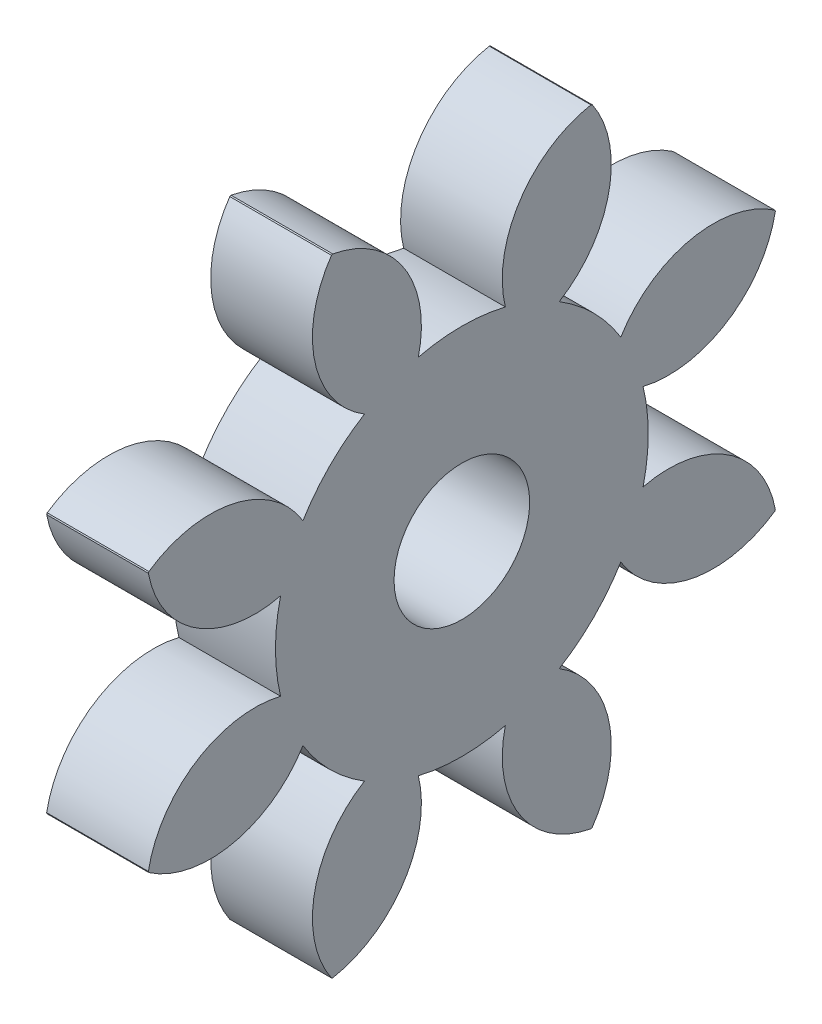
ISO-10303-21;
HEADER;
FILE_DESCRIPTION(('STEP AP214'),'2;1');
FILE_NAME('part.step','',(''),(''),'','','');
FILE_SCHEMA(('AUTOMOTIVE_DESIGN { 1 0 10303 214 1 1 1 1 }'));
ENDSEC;
DATA;
#1=APPLICATION_CONTEXT('core data for automotive mechanical design processes');
#2=APPLICATION_PROTOCOL_DEFINITION('international standard','automotive_design',2000,#1);
#3=PRODUCT_CONTEXT('',#1,'mechanical');
#4=PRODUCT('Part','Part','',(#3));
#5=PRODUCT_RELATED_PRODUCT_CATEGORY('part','',(#4));
#6=PRODUCT_DEFINITION_FORMATION('','',#4);
#7=PRODUCT_DEFINITION_CONTEXT('part definition',#1,'design');
#8=PRODUCT_DEFINITION('design','',#6,#7);
#9=PRODUCT_DEFINITION_SHAPE('','',#8);
#10=(LENGTH_UNIT() NAMED_UNIT(*) SI_UNIT(.MILLI.,.METRE.));
#11=(NAMED_UNIT(*) PLANE_ANGLE_UNIT() SI_UNIT($,.RADIAN.));
#12=(NAMED_UNIT(*) SI_UNIT($,.STERADIAN.) SOLID_ANGLE_UNIT());
#13=UNCERTAINTY_MEASURE_WITH_UNIT(LENGTH_MEASURE(1.E-05),#10,'distance_accuracy_value','');
#14=(GEOMETRIC_REPRESENTATION_CONTEXT(3) GLOBAL_UNCERTAINTY_ASSIGNED_CONTEXT((#13)) GLOBAL_UNIT_ASSIGNED_CONTEXT((#10,
#11,#12)) REPRESENTATION_CONTEXT('',''));
#15=CARTESIAN_POINT('',(0.,0.,0.));
#16=DIRECTION('',(0.,0.,1.));
#17=DIRECTION('',(1.,0.,0.));
#18=AXIS2_PLACEMENT_3D('',#15,#16,#17);
#19=CARTESIAN_POINT('',(1.5,0.,0.));
#20=DIRECTION('',(-1.,0.,0.));
#21=DIRECTION('',(0.,0.,1.));
#22=AXIS2_PLACEMENT_3D('',#19,#20,#21);
#23=PLANE('',#22);
#24=CARTESIAN_POINT('',(1.5,0.,0.));
#25=DIRECTION('',(-1.,0.,0.));
#26=DIRECTION('',(0.,0.,1.));
#27=AXIS2_PLACEMENT_3D('',#24,#25,#26);
#28=CIRCLE('',#27,1.);
#29=CARTESIAN_POINT('',(1.5,0.,1.));
#30=VERTEX_POINT('',#29);
#31=EDGE_CURVE('E294',#30,#30,#28,.F.);
#32=ORIENTED_EDGE('',*,*,#31,.F.);
#33=EDGE_LOOP('',(#32));
#34=FACE_BOUND('',#33,.T.);
#35=CARTESIAN_POINT('',(1.5,0.603752810087811,3.70996470244194));
#36=DIRECTION('',(-1.,0.,0.));
#37=DIRECTION('',(0.,0.707106781186549,-0.707106781186546));
#38=AXIS2_PLACEMENT_3D('',#35,#36,#37);
#39=CIRCLE('',#38,1.6);
#40=CARTESIAN_POINT('',(1.5,1.92286389301455,4.61547337214082));
#41=VERTEX_POINT('',#40);
#42=CARTESIAN_POINT('',(1.5,1.43655002864459,2.34378433632475));
#43=VERTEX_POINT('',#42);
#44=EDGE_CURVE('E416',#41,#43,#39,.T.);
#45=ORIENTED_EDGE('',*,*,#44,.F.);
#46=CARTESIAN_POINT('',(1.5,0.,0.));
#47=DIRECTION('',(-1.,0.,0.));
#48=DIRECTION('',(0.,0.,1.));
#49=AXIS2_PLACEMENT_3D('',#46,#47,#48);
#50=CIRCLE('',#49,5.);
#51=CARTESIAN_POINT('',(1.5,1.90396242177733,4.62330261787608));
#52=VERTEX_POINT('',#51);
#53=EDGE_CURVE('E580',#52,#41,#50,.T.);
#54=ORIENTED_EDGE('',*,*,#53,.F.);
#55=CARTESIAN_POINT('',(1.5,2.19642349288588,3.05025890523296));
#56=DIRECTION('',(-1.,0.,0.));
#57=DIRECTION('',(0.,1.,0.));
#58=AXIS2_PLACEMENT_3D('',#55,#56,#57);
#59=CIRCLE('',#58,1.6);
#60=CARTESIAN_POINT('',(1.5,0.641511531085708,2.67310006462236));
#61=VERTEX_POINT('',#60);
#62=EDGE_CURVE('E392',#61,#52,#59,.T.);
#63=ORIENTED_EDGE('',*,*,#62,.F.);
#64=CARTESIAN_POINT('',(1.5,0.,0.));
#65=DIRECTION('',(-1.,0.,0.));
#66=DIRECTION('',(0.,1.,0.));
#67=AXIS2_PLACEMENT_3D('',#64,#65,#66);
#68=CIRCLE('',#67,2.749);
#69=CARTESIAN_POINT('',(1.5,-0.641511531085726,2.67310006462236));
#70=VERTEX_POINT('',#69);
#71=EDGE_CURVE('E399',#70,#61,#68,.T.);
#72=ORIENTED_EDGE('',*,*,#71,.F.);
#73=CARTESIAN_POINT('',(1.5,-2.1964234928859,3.05025890523294));
#74=DIRECTION('',(-1.,0.,0.));
#75=DIRECTION('',(0.,1.,0.));
#76=AXIS2_PLACEMENT_3D('',#73,#74,#75);
#77=CIRCLE('',#76,1.6);
#78=CARTESIAN_POINT('',(1.5,-1.90396242177737,4.62330261787606));
#79=VERTEX_POINT('',#78);
#80=EDGE_CURVE('E395',#79,#70,#77,.T.);
#81=ORIENTED_EDGE('',*,*,#80,.F.);
#82=CARTESIAN_POINT('',(1.5,-1.92286389301459,4.6154733721408));
#83=VERTEX_POINT('',#82);
#84=EDGE_CURVE('E553',#83,#79,#50,.T.);
#85=ORIENTED_EDGE('',*,*,#84,.F.);
#86=CARTESIAN_POINT('',(1.5,-0.603752810087837,3.70996470244193));
#87=DIRECTION('',(-1.,0.,0.));
#88=DIRECTION('',(0.,0.707106781186544,0.707106781186551));
#89=AXIS2_PLACEMENT_3D('',#86,#87,#88);
#90=CIRCLE('',#89,1.6);
#91=CARTESIAN_POINT('',(1.5,-1.43655002864461,2.34378433632474));
#92=VERTEX_POINT('',#91);
#93=EDGE_CURVE('E369',#92,#83,#90,.T.);
#94=ORIENTED_EDGE('',*,*,#93,.F.);
#95=CARTESIAN_POINT('',(1.5,0.,0.));
#96=DIRECTION('',(-1.,0.,0.));
#97=DIRECTION('',(0.,0.707106781186544,0.707106781186551));
#98=AXIS2_PLACEMENT_3D('',#95,#96,#97);
#99=CIRCLE('',#98,2.749);
#100=CARTESIAN_POINT('',(1.5,-2.34378433632475,1.43655002864458));
#101=VERTEX_POINT('',#100);
#102=EDGE_CURVE('E376',#101,#92,#99,.T.);
#103=ORIENTED_EDGE('',*,*,#102,.F.);
#104=CARTESIAN_POINT('',(1.5,-3.70996470244194,0.603752810087798));
#105=DIRECTION('',(-1.,0.,0.));
#106=DIRECTION('',(0.,0.707106781186544,0.707106781186551));
#107=AXIS2_PLACEMENT_3D('',#104,#105,#106);
#108=CIRCLE('',#107,1.6);
#109=CARTESIAN_POINT('',(1.5,-4.61547337214082,1.92286389301454));
#110=VERTEX_POINT('',#109);
#111=EDGE_CURVE('E372',#110,#101,#108,.T.);
#112=ORIENTED_EDGE('',*,*,#111,.F.);
#113=CARTESIAN_POINT('',(1.5,-4.62330261787608,1.90396242177732));
#114=VERTEX_POINT('',#113);
#115=EDGE_CURVE('E588',#114,#110,#50,.T.);
#116=ORIENTED_EDGE('',*,*,#115,.F.);
#117=CARTESIAN_POINT('',(1.5,-3.05025890523297,2.19642349288587));
#118=DIRECTION('',(-1.,0.,0.));
#119=DIRECTION('',(0.,0.,1.));
#120=AXIS2_PLACEMENT_3D('',#117,#118,#119);
#121=CIRCLE('',#120,1.6);
#122=CARTESIAN_POINT('',(1.5,-2.67310006462236,0.641511531085698));
#123=VERTEX_POINT('',#122);
#124=EDGE_CURVE('E345',#123,#114,#121,.T.);
#125=ORIENTED_EDGE('',*,*,#124,.F.);
#126=CARTESIAN_POINT('',(1.5,0.,0.));
#127=DIRECTION('',(-1.,0.,0.));
#128=DIRECTION('',(0.,0.,1.));
#129=AXIS2_PLACEMENT_3D('',#126,#127,#128);
#130=CIRCLE('',#129,2.749);
#131=CARTESIAN_POINT('',(1.5,-2.67310006462236,-0.641511531085736));
#132=VERTEX_POINT('',#131);
#133=EDGE_CURVE('E352',#132,#123,#130,.T.);
#134=ORIENTED_EDGE('',*,*,#133,.F.);
#135=CARTESIAN_POINT('',(1.5,-3.05025890523294,-2.19642349288591));
#136=DIRECTION('',(-1.,0.,0.));
#137=DIRECTION('',(0.,0.,1.));
#138=AXIS2_PLACEMENT_3D('',#135,#136,#137);
#139=CIRCLE('',#138,1.6);
#140=CARTESIAN_POINT('',(1.5,-4.62330261787606,-1.90396242177738));
#141=VERTEX_POINT('',#140);
#142=EDGE_CURVE('E348',#141,#132,#139,.T.);
#143=ORIENTED_EDGE('',*,*,#142,.F.);
#144=CARTESIAN_POINT('',(1.5,-4.6154733721408,-1.9228638930146));
#145=VERTEX_POINT('',#144);
#146=EDGE_CURVE('E591',#145,#141,#50,.T.);
#147=ORIENTED_EDGE('',*,*,#146,.F.);
#148=CARTESIAN_POINT('',(1.5,-3.70996470244193,-0.60375281008785));
#149=DIRECTION('',(-1.,0.,0.));
#150=DIRECTION('',(0.,-0.707106781186554,0.707106781186541));
#151=AXIS2_PLACEMENT_3D('',#148,#149,#150);
#152=CIRCLE('',#151,1.6);
#153=CARTESIAN_POINT('',(1.5,-2.34378433632473,-1.43655002864461));
#154=VERTEX_POINT('',#153);
#155=EDGE_CURVE('E321',#154,#145,#152,.T.);
#156=ORIENTED_EDGE('',*,*,#155,.F.);
#157=CARTESIAN_POINT('',(1.5,0.,0.));
#158=DIRECTION('',(-1.,0.,0.));
#159=DIRECTION('',(0.,-0.707106781186554,0.707106781186541));
#160=AXIS2_PLACEMENT_3D('',#157,#158,#159);
#161=CIRCLE('',#160,2.749);
#162=CARTESIAN_POINT('',(1.5,-1.43655002864457,-2.34378433632476));
#163=VERTEX_POINT('',#162);
#164=EDGE_CURVE('E328',#163,#154,#161,.T.);
#165=ORIENTED_EDGE('',*,*,#164,.F.);
#166=CARTESIAN_POINT('',(1.5,-0.603752810087786,-3.70996470244194));
#167=DIRECTION('',(-1.,0.,0.));
#168=DIRECTION('',(0.,-0.707106781186554,0.707106781186541));
#169=AXIS2_PLACEMENT_3D('',#166,#167,#168);
#170=CIRCLE('',#169,1.6);
#171=CARTESIAN_POINT('',(1.5,-1.92286389301452,-4.61547337214083));
#172=VERTEX_POINT('',#171);
#173=EDGE_CURVE('E324',#172,#163,#170,.T.);
#174=ORIENTED_EDGE('',*,*,#173,.F.);
#175=CARTESIAN_POINT('',(1.5,-1.9039624217773,-4.62330261787609));
#176=VERTEX_POINT('',#175);
#177=EDGE_CURVE('E598',#176,#172,#50,.T.);
#178=ORIENTED_EDGE('',*,*,#177,.F.);
#179=CARTESIAN_POINT('',(1.5,-2.19642349288586,-3.05025890523298));
#180=DIRECTION('',(-1.,0.,0.));
#181=DIRECTION('',(0.,-1.,0.));
#182=AXIS2_PLACEMENT_3D('',#179,#180,#181);
#183=CIRCLE('',#182,1.6);
#184=CARTESIAN_POINT('',(1.5,-0.641511531085689,-2.67310006462237));
#185=VERTEX_POINT('',#184);
#186=EDGE_CURVE('E297',#185,#176,#183,.T.);
#187=ORIENTED_EDGE('',*,*,#186,.F.);
#188=CARTESIAN_POINT('',(1.5,0.,0.));
#189=DIRECTION('',(-1.,0.,0.));
#190=DIRECTION('',(0.,-1.,0.));
#191=AXIS2_PLACEMENT_3D('',#188,#189,#190);
#192=CIRCLE('',#191,2.749);
#193=CARTESIAN_POINT('',(1.5,0.641511531085745,-2.67310006462235));
#194=VERTEX_POINT('',#193);
#195=EDGE_CURVE('E304',#194,#185,#192,.T.);
#196=ORIENTED_EDGE('',*,*,#195,.F.);
#197=CARTESIAN_POINT('',(1.5,2.19642349288593,-3.05025890523293));
#198=DIRECTION('',(-1.,0.,0.));
#199=DIRECTION('',(0.,-1.,0.));
#200=AXIS2_PLACEMENT_3D('',#197,#198,#199);
#201=CIRCLE('',#200,1.6);
#202=CARTESIAN_POINT('',(1.5,1.9039624217774,-4.62330261787605));
#203=VERTEX_POINT('',#202);
#204=EDGE_CURVE('E300',#203,#194,#201,.T.);
#205=ORIENTED_EDGE('',*,*,#204,.F.);
#206=CARTESIAN_POINT('',(1.5,1.92286389301462,-4.61547337214079));
#207=VERTEX_POINT('',#206);
#208=EDGE_CURVE('E517',#207,#203,#50,.T.);
#209=ORIENTED_EDGE('',*,*,#208,.F.);
#210=CARTESIAN_POINT('',(1.5,0.603752810087863,-3.70996470244193));
#211=DIRECTION('',(-1.,0.,0.));
#212=DIRECTION('',(0.,-0.707106781186539,-0.707106781186556));
#213=AXIS2_PLACEMENT_3D('',#210,#211,#212);
#214=CIRCLE('',#213,1.6);
#215=CARTESIAN_POINT('',(1.5,1.43655002864462,-2.34378433632473));
#216=VERTEX_POINT('',#215);
#217=EDGE_CURVE('E268',#216,#207,#214,.T.);
#218=ORIENTED_EDGE('',*,*,#217,.F.);
#219=CARTESIAN_POINT('',(1.5,0.,0.));
#220=DIRECTION('',(-1.,0.,0.));
#221=DIRECTION('',(0.,-0.707106781186539,-0.707106781186556));
#222=AXIS2_PLACEMENT_3D('',#219,#220,#221);
#223=CIRCLE('',#222,2.749);
#224=CARTESIAN_POINT('',(1.5,2.34378433632476,-1.43655002864457));
#225=VERTEX_POINT('',#224);
#226=EDGE_CURVE('E267',#225,#216,#223,.T.);
#227=ORIENTED_EDGE('',*,*,#226,.F.);
#228=CARTESIAN_POINT('',(1.5,3.70996470244194,-0.603752810087773));
#229=DIRECTION('',(-1.,0.,0.));
#230=DIRECTION('',(0.,-0.707106781186539,-0.707106781186556));
#231=AXIS2_PLACEMENT_3D('',#228,#229,#230);
#232=CIRCLE('',#231,1.6);
#233=CARTESIAN_POINT('',(1.5,4.61547337214084,-1.92286389301451));
#234=VERTEX_POINT('',#233);
#235=EDGE_CURVE('E255',#234,#225,#232,.T.);
#236=ORIENTED_EDGE('',*,*,#235,.F.);
#237=CARTESIAN_POINT('',(1.5,4.62330261787607,-1.90396242177735));
#238=VERTEX_POINT('',#237);
#239=EDGE_CURVE('E513',#238,#234,#50,.T.);
#240=ORIENTED_EDGE('',*,*,#239,.F.);
#241=CARTESIAN_POINT('',(1.5,3.05025890523295,-2.19642349288589));
#242=DIRECTION('',(-1.,0.,0.));
#243=DIRECTION('',(0.,0.,-1.));
#244=AXIS2_PLACEMENT_3D('',#241,#242,#243);
#245=CIRCLE('',#244,1.6);
#246=CARTESIAN_POINT('',(1.5,2.67310006462236,-0.641511531085717));
#247=VERTEX_POINT('',#246);
#248=EDGE_CURVE('E476',#247,#238,#245,.T.);
#249=ORIENTED_EDGE('',*,*,#248,.F.);
#250=CARTESIAN_POINT('',(1.5,0.,0.));
#251=DIRECTION('',(-1.,0.,0.));
#252=DIRECTION('',(0.,0.,-1.));
#253=AXIS2_PLACEMENT_3D('',#250,#251,#252);
#254=CIRCLE('',#253,2.749);
#255=CARTESIAN_POINT('',(1.5,2.67310006462236,0.641511531085717));
#256=VERTEX_POINT('',#255);
#257=EDGE_CURVE('E483',#256,#247,#254,.T.);
#258=ORIENTED_EDGE('',*,*,#257,.F.);
#259=CARTESIAN_POINT('',(1.5,3.05025890523295,2.19642349288589));
#260=DIRECTION('',(-1.,0.,0.));
#261=DIRECTION('',(0.,0.,-1.));
#262=AXIS2_PLACEMENT_3D('',#259,#260,#261);
#263=CIRCLE('',#262,1.6);
#264=CARTESIAN_POINT('',(1.5,4.62330261787607,1.90396242177735));
#265=VERTEX_POINT('',#264);
#266=EDGE_CURVE('E479',#265,#256,#263,.T.);
#267=ORIENTED_EDGE('',*,*,#266,.F.);
#268=CARTESIAN_POINT('',(1.5,4.61547337214081,1.92286389301457));
#269=VERTEX_POINT('',#268);
#270=EDGE_CURVE('E511',#269,#265,#50,.T.);
#271=ORIENTED_EDGE('',*,*,#270,.F.);
#272=CARTESIAN_POINT('',(1.5,3.70996470244193,0.603752810087824));
#273=DIRECTION('',(-1.,0.,0.));
#274=DIRECTION('',(0.,0.707106781186549,-0.707106781186546));
#275=AXIS2_PLACEMENT_3D('',#272,#273,#274);
#276=CIRCLE('',#275,1.6);
#277=CARTESIAN_POINT('',(1.5,2.34378433632474,1.4365500286446));
#278=VERTEX_POINT('',#277);
#279=EDGE_CURVE('E413',#278,#269,#276,.T.);
#280=ORIENTED_EDGE('',*,*,#279,.F.);
#281=CARTESIAN_POINT('',(1.5,0.,0.));
#282=DIRECTION('',(-1.,0.,0.));
#283=DIRECTION('',(0.,0.707106781186549,-0.707106781186546));
#284=AXIS2_PLACEMENT_3D('',#281,#282,#283);
#285=CIRCLE('',#284,2.749);
#286=EDGE_CURVE('E420',#43,#278,#285,.T.);
#287=ORIENTED_EDGE('',*,*,#286,.F.);
#288=EDGE_LOOP('',(#45,#54,#63,#72,#81,#85,#94,#103,#112,#116,#125,#134,#143,#147,#156,#165,
#174,#178,#187,#196,#205,#209,#218,#227,#236,#240,#249,#258,#267,#271,#280,#287));
#289=FACE_BOUND('',#288,.T.);
#290=ADVANCED_FACE('F45',(#34,#289),#23,.F.);
#291=CARTESIAN_POINT('',(-10.,0.,0.));
#292=DIRECTION('',(-1.,0.,0.));
#293=DIRECTION('',(0.,0.,1.));
#294=AXIS2_PLACEMENT_3D('',#291,#292,#293);
#295=CYLINDRICAL_SURFACE('',#294,5.);
#296=DIRECTION('',(-1.,0.,0.));
#297=VECTOR('',#296,1.);
#298=CARTESIAN_POINT('',(0.75,1.92286389301455,4.61547337214082));
#299=LINE('',#298,#297);
#300=CARTESIAN_POINT('',(0.,1.92286389301455,4.61547337214082));
#301=VERTEX_POINT('',#300);
#302=EDGE_CURVE('E472',#301,#41,#299,.F.);
#303=ORIENTED_EDGE('',*,*,#302,.F.);
#304=CARTESIAN_POINT('',(0.,0.,0.));
#305=DIRECTION('',(-1.,0.,0.));
#306=DIRECTION('',(0.,0.,1.));
#307=AXIS2_PLACEMENT_3D('',#304,#305,#306);
#308=CIRCLE('',#307,5.);
#309=CARTESIAN_POINT('',(0.,1.90396242177733,4.62330261787608));
#310=VERTEX_POINT('',#309);
#311=EDGE_CURVE('E558',#310,#301,#308,.T.);
#312=ORIENTED_EDGE('',*,*,#311,.F.);
#313=DIRECTION('',(-1.,0.,0.));
#314=VECTOR('',#313,1.);
#315=CARTESIAN_POINT('',(0.75,1.90396242177733,4.62330261787608));
#316=LINE('',#315,#314);
#317=EDGE_CURVE('E466',#52,#310,#316,.T.);
#318=ORIENTED_EDGE('',*,*,#317,.F.);
#319=ORIENTED_EDGE('',*,*,#53,.T.);
#320=EDGE_LOOP('',(#303,#312,#318,#319));
#321=FACE_BOUND('',#320,.T.);
#322=ADVANCED_FACE('F671',(#321),#295,.T.);
#323=DIRECTION('',(-1.,0.,0.));
#324=VECTOR('',#323,1.);
#325=CARTESIAN_POINT('',(0.75,4.61547337214081,1.92286389301457));
#326=LINE('',#325,#324);
#327=CARTESIAN_POINT('',(0.,4.61547337214081,1.92286389301457));
#328=VERTEX_POINT('',#327);
#329=EDGE_CURVE('E469',#269,#328,#326,.T.);
#330=ORIENTED_EDGE('',*,*,#329,.F.);
#331=ORIENTED_EDGE('',*,*,#270,.T.);
#332=DIRECTION('',(-1.,0.,0.));
#333=VECTOR('',#332,1.);
#334=CARTESIAN_POINT('',(0.75,4.62330261787607,1.90396242177735));
#335=LINE('',#334,#333);
#336=CARTESIAN_POINT('',(0.,4.62330261787607,1.90396242177735));
#337=VERTEX_POINT('',#336);
#338=EDGE_CURVE('E499',#337,#265,#335,.F.);
#339=ORIENTED_EDGE('',*,*,#338,.F.);
#340=EDGE_CURVE('E506',#328,#337,#308,.T.);
#341=ORIENTED_EDGE('',*,*,#340,.F.);
#342=EDGE_LOOP('',(#330,#331,#339,#341));
#343=FACE_BOUND('',#342,.T.);
#344=ADVANCED_FACE('F576',(#343),#295,.T.);
#345=DIRECTION('',(-1.,0.,0.));
#346=VECTOR('',#345,1.);
#347=CARTESIAN_POINT('',(0.75,-4.62330261787606,-1.90396242177738));
#348=LINE('',#347,#346);
#349=CARTESIAN_POINT('',(0.,-4.62330261787606,-1.90396242177738));
#350=VERTEX_POINT('',#349);
#351=EDGE_CURVE('E463',#350,#141,#348,.F.);
#352=ORIENTED_EDGE('',*,*,#351,.F.);
#353=CARTESIAN_POINT('',(0.,-4.6154733721408,-1.9228638930146));
#354=VERTEX_POINT('',#353);
#355=EDGE_CURVE('E562',#354,#350,#308,.T.);
#356=ORIENTED_EDGE('',*,*,#355,.F.);
#357=DIRECTION('',(-1.,0.,0.));
#358=VECTOR('',#357,1.);
#359=CARTESIAN_POINT('',(0.75,-4.6154733721408,-1.9228638930146));
#360=LINE('',#359,#358);
#361=EDGE_CURVE('E448',#145,#354,#360,.T.);
#362=ORIENTED_EDGE('',*,*,#361,.F.);
#363=ORIENTED_EDGE('',*,*,#146,.T.);
#364=EDGE_LOOP('',(#352,#356,#362,#363));
#365=FACE_BOUND('',#364,.T.);
#366=ADVANCED_FACE('F638',(#365),#295,.T.);
#367=DIRECTION('',(-1.,0.,0.));
#368=VECTOR('',#367,1.);
#369=CARTESIAN_POINT('',(0.75,-1.90396242177737,4.62330261787606));
#370=LINE('',#369,#368);
#371=CARTESIAN_POINT('',(0.,-1.90396242177737,4.62330261787606));
#372=VERTEX_POINT('',#371);
#373=EDGE_CURVE('E460',#372,#79,#370,.F.);
#374=ORIENTED_EDGE('',*,*,#373,.F.);
#375=CARTESIAN_POINT('',(0.,-1.92286389301459,4.6154733721408));
#376=VERTEX_POINT('',#375);
#377=EDGE_CURVE('E551',#376,#372,#308,.T.);
#378=ORIENTED_EDGE('',*,*,#377,.F.);
#379=DIRECTION('',(-1.,0.,0.));
#380=VECTOR('',#379,1.);
#381=CARTESIAN_POINT('',(0.75,-1.92286389301459,4.6154733721408));
#382=LINE('',#381,#380);
#383=EDGE_CURVE('E457',#83,#376,#382,.T.);
#384=ORIENTED_EDGE('',*,*,#383,.F.);
#385=ORIENTED_EDGE('',*,*,#84,.T.);
#386=EDGE_LOOP('',(#374,#378,#384,#385));
#387=FACE_BOUND('',#386,.T.);
#388=ADVANCED_FACE('F549',(#387),#295,.T.);
#389=DIRECTION('',(-1.,0.,0.));
#390=VECTOR('',#389,1.);
#391=CARTESIAN_POINT('',(0.75,-4.61547337214082,1.92286389301454));
#392=LINE('',#391,#390);
#393=CARTESIAN_POINT('',(0.,-4.61547337214082,1.92286389301454));
#394=VERTEX_POINT('',#393);
#395=EDGE_CURVE('E454',#394,#110,#392,.F.);
#396=ORIENTED_EDGE('',*,*,#395,.F.);
#397=CARTESIAN_POINT('',(0.,-4.62330261787608,1.90396242177732));
#398=VERTEX_POINT('',#397);
#399=EDGE_CURVE('E557',#398,#394,#308,.T.);
#400=ORIENTED_EDGE('',*,*,#399,.F.);
#401=DIRECTION('',(-1.,0.,0.));
#402=VECTOR('',#401,1.);
#403=CARTESIAN_POINT('',(0.75,-4.62330261787608,1.90396242177732));
#404=LINE('',#403,#402);
#405=EDGE_CURVE('E451',#114,#398,#404,.T.);
#406=ORIENTED_EDGE('',*,*,#405,.F.);
#407=ORIENTED_EDGE('',*,*,#115,.T.);
#408=EDGE_LOOP('',(#396,#400,#406,#407));
#409=FACE_BOUND('',#408,.T.);
#410=ADVANCED_FACE('F654',(#409),#295,.T.);
#411=DIRECTION('',(-1.,0.,0.));
#412=VECTOR('',#411,1.);
#413=CARTESIAN_POINT('',(0.75,-1.92286389301452,-4.61547337214083));
#414=LINE('',#413,#412);
#415=CARTESIAN_POINT('',(0.,-1.92286389301452,-4.61547337214083));
#416=VERTEX_POINT('',#415);
#417=EDGE_CURVE('E445',#416,#172,#414,.F.);
#418=ORIENTED_EDGE('',*,*,#417,.F.);
#419=CARTESIAN_POINT('',(0.,-1.9039624217773,-4.62330261787609));
#420=VERTEX_POINT('',#419);
#421=EDGE_CURVE('E629',#420,#416,#308,.T.);
#422=ORIENTED_EDGE('',*,*,#421,.F.);
#423=DIRECTION('',(-1.,0.,0.));
#424=VECTOR('',#423,1.);
#425=CARTESIAN_POINT('',(0.75,-1.9039624217773,-4.62330261787609));
#426=LINE('',#425,#424);
#427=EDGE_CURVE('E442',#176,#420,#426,.T.);
#428=ORIENTED_EDGE('',*,*,#427,.F.);
#429=ORIENTED_EDGE('',*,*,#177,.T.);
#430=EDGE_LOOP('',(#418,#422,#428,#429));
#431=FACE_BOUND('',#430,.T.);
#432=ADVANCED_FACE('F926',(#431),#295,.T.);
#433=DIRECTION('',(-1.,0.,0.));
#434=VECTOR('',#433,1.);
#435=CARTESIAN_POINT('',(0.75,1.9039624217774,-4.62330261787605));
#436=LINE('',#435,#434);
#437=CARTESIAN_POINT('',(0.,1.9039624217774,-4.62330261787605));
#438=VERTEX_POINT('',#437);
#439=EDGE_CURVE('E439',#438,#203,#436,.F.);
#440=ORIENTED_EDGE('',*,*,#439,.F.);
#441=CARTESIAN_POINT('',(0.,1.92286389301462,-4.61547337214079));
#442=VERTEX_POINT('',#441);
#443=EDGE_CURVE('E512',#442,#438,#308,.T.);
#444=ORIENTED_EDGE('',*,*,#443,.F.);
#445=DIRECTION('',(-1.,0.,0.));
#446=VECTOR('',#445,1.);
#447=CARTESIAN_POINT('',(0.75,1.92286389301462,-4.61547337214079));
#448=LINE('',#447,#446);
#449=EDGE_CURVE('E436',#207,#442,#448,.T.);
#450=ORIENTED_EDGE('',*,*,#449,.F.);
#451=ORIENTED_EDGE('',*,*,#208,.T.);
#452=EDGE_LOOP('',(#440,#444,#450,#451));
#453=FACE_BOUND('',#452,.T.);
#454=ADVANCED_FACE('F614',(#453),#295,.T.);
#455=DIRECTION('',(-1.,0.,0.));
#456=VECTOR('',#455,1.);
#457=CARTESIAN_POINT('',(0.75,4.61547337214084,-1.92286389301451));
#458=LINE('',#457,#456);
#459=CARTESIAN_POINT('',(0.,4.61547337214084,-1.92286389301451));
#460=VERTEX_POINT('',#459);
#461=EDGE_CURVE('E261',#460,#234,#458,.F.);
#462=ORIENTED_EDGE('',*,*,#461,.F.);
#463=CARTESIAN_POINT('',(0.,4.62330261787607,-1.90396242177735));
#464=VERTEX_POINT('',#463);
#465=EDGE_CURVE('E507',#464,#460,#308,.T.);
#466=ORIENTED_EDGE('',*,*,#465,.F.);
#467=DIRECTION('',(-1.,0.,0.));
#468=VECTOR('',#467,1.);
#469=CARTESIAN_POINT('',(0.75,4.62330261787607,-1.90396242177735));
#470=LINE('',#469,#468);
#471=EDGE_CURVE('E503',#238,#464,#470,.T.);
#472=ORIENTED_EDGE('',*,*,#471,.F.);
#473=ORIENTED_EDGE('',*,*,#239,.T.);
#474=EDGE_LOOP('',(#462,#466,#472,#473));
#475=FACE_BOUND('',#474,.T.);
#476=ADVANCED_FACE('F697',(#475),#295,.T.);
#477=CARTESIAN_POINT('',(0.,0.,0.));
#478=DIRECTION('',(1.,0.,0.));
#479=DIRECTION('',(0.,0.,-1.));
#480=AXIS2_PLACEMENT_3D('',#477,#478,#479);
#481=PLANE('',#480);
#482=CARTESIAN_POINT('',(0.,0.,0.));
#483=DIRECTION('',(1.,0.,0.));
#484=DIRECTION('',(0.,0.,-1.));
#485=AXIS2_PLACEMENT_3D('',#482,#483,#484);
#486=CIRCLE('',#485,1.);
#487=CARTESIAN_POINT('',(0.,0.,-1.));
#488=VERTEX_POINT('',#487);
#489=EDGE_CURVE('E48',#488,#488,#486,.F.);
#490=ORIENTED_EDGE('',*,*,#489,.F.);
#491=EDGE_LOOP('',(#490));
#492=FACE_BOUND('',#491,.T.);
#493=CARTESIAN_POINT('',(0.,0.603752810087811,3.70996470244194));
#494=DIRECTION('',(1.,0.,0.));
#495=DIRECTION('',(0.,0.,-1.));
#496=AXIS2_PLACEMENT_3D('',#493,#494,#495);
#497=CIRCLE('',#496,1.6);
#498=CARTESIAN_POINT('',(0.,1.43655002864459,2.34378433632475));
#499=VERTEX_POINT('',#498);
#500=EDGE_CURVE('E11',#499,#301,#497,.T.);
#501=ORIENTED_EDGE('',*,*,#500,.F.);
#502=CARTESIAN_POINT('',(0.,0.,0.));
#503=DIRECTION('',(-1.,0.,0.));
#504=DIRECTION('',(0.,0.707106781186549,-0.707106781186546));
#505=AXIS2_PLACEMENT_3D('',#502,#503,#504);
#506=CIRCLE('',#505,2.749);
#507=CARTESIAN_POINT('',(0.,2.34378433632474,1.4365500286446));
#508=VERTEX_POINT('',#507);
#509=EDGE_CURVE('E417',#499,#508,#506,.T.);
#510=ORIENTED_EDGE('',*,*,#509,.T.);
#511=CARTESIAN_POINT('',(0.,3.70996470244193,0.603752810087824));
#512=DIRECTION('',(-1.,0.,0.));
#513=DIRECTION('',(0.,0.707106781186549,-0.707106781186546));
#514=AXIS2_PLACEMENT_3D('',#511,#512,#513);
#515=CIRCLE('',#514,1.6);
#516=EDGE_CURVE('E61',#508,#328,#515,.T.);
#517=ORIENTED_EDGE('',*,*,#516,.T.);
#518=ORIENTED_EDGE('',*,*,#340,.T.);
#519=CARTESIAN_POINT('',(0.,3.05025890523295,2.19642349288589));
#520=DIRECTION('',(1.,0.,0.));
#521=DIRECTION('',(0.,0.,-1.));
#522=AXIS2_PLACEMENT_3D('',#519,#520,#521);
#523=CIRCLE('',#522,1.6);
#524=CARTESIAN_POINT('',(0.,2.67310006462236,0.641511531085717));
#525=VERTEX_POINT('',#524);
#526=EDGE_CURVE('E516',#525,#337,#523,.T.);
#527=ORIENTED_EDGE('',*,*,#526,.F.);
#528=CARTESIAN_POINT('',(0.,0.,0.));
#529=DIRECTION('',(-1.,0.,0.));
#530=DIRECTION('',(0.,0.,-1.));
#531=AXIS2_PLACEMENT_3D('',#528,#529,#530);
#532=CIRCLE('',#531,2.749);
#533=CARTESIAN_POINT('',(0.,2.67310006462236,-0.641511531085717));
#534=VERTEX_POINT('',#533);
#535=EDGE_CURVE('E480',#525,#534,#532,.T.);
#536=ORIENTED_EDGE('',*,*,#535,.T.);
#537=CARTESIAN_POINT('',(0.,3.05025890523295,-2.19642349288589));
#538=DIRECTION('',(-1.,0.,0.));
#539=DIRECTION('',(0.,0.,-1.));
#540=AXIS2_PLACEMENT_3D('',#537,#538,#539);
#541=CIRCLE('',#540,1.6);
#542=EDGE_CURVE('E475',#534,#464,#541,.T.);
#543=ORIENTED_EDGE('',*,*,#542,.T.);
#544=ORIENTED_EDGE('',*,*,#465,.T.);
#545=CARTESIAN_POINT('',(0.,3.70996470244194,-0.603752810087773));
#546=DIRECTION('',(1.,0.,0.));
#547=DIRECTION('',(0.,0.,-1.));
#548=AXIS2_PLACEMENT_3D('',#545,#546,#547);
#549=CIRCLE('',#548,1.6);
#550=CARTESIAN_POINT('',(0.,2.34378433632476,-1.43655002864457));
#551=VERTEX_POINT('',#550);
#552=EDGE_CURVE('E521',#551,#460,#549,.T.);
#553=ORIENTED_EDGE('',*,*,#552,.F.);
#554=CARTESIAN_POINT('',(0.,0.,0.));
#555=DIRECTION('',(-1.,0.,0.));
#556=DIRECTION('',(0.,-0.707106781186539,-0.707106781186556));
#557=AXIS2_PLACEMENT_3D('',#554,#555,#556);
#558=CIRCLE('',#557,2.749);
#559=CARTESIAN_POINT('',(0.,1.43655002864462,-2.34378433632473));
#560=VERTEX_POINT('',#559);
#561=EDGE_CURVE('E275',#551,#560,#558,.T.);
#562=ORIENTED_EDGE('',*,*,#561,.T.);
#563=CARTESIAN_POINT('',(0.,0.603752810087863,-3.70996470244193));
#564=DIRECTION('',(-1.,0.,0.));
#565=DIRECTION('',(0.,-0.707106781186539,-0.707106781186556));
#566=AXIS2_PLACEMENT_3D('',#563,#564,#565);
#567=CIRCLE('',#566,1.6);
#568=EDGE_CURVE('E290',#560,#442,#567,.T.);
#569=ORIENTED_EDGE('',*,*,#568,.T.);
#570=ORIENTED_EDGE('',*,*,#443,.T.);
#571=CARTESIAN_POINT('',(0.,2.19642349288593,-3.05025890523293));
#572=DIRECTION('',(1.,0.,0.));
#573=DIRECTION('',(0.,0.,-1.));
#574=AXIS2_PLACEMENT_3D('',#571,#572,#573);
#575=CIRCLE('',#574,1.6);
#576=CARTESIAN_POINT('',(0.,0.641511531085745,-2.67310006462235));
#577=VERTEX_POINT('',#576);
#578=EDGE_CURVE('E524',#577,#438,#575,.T.);
#579=ORIENTED_EDGE('',*,*,#578,.F.);
#580=CARTESIAN_POINT('',(0.,0.,0.));
#581=DIRECTION('',(-1.,0.,0.));
#582=DIRECTION('',(0.,-1.,0.));
#583=AXIS2_PLACEMENT_3D('',#580,#581,#582);
#584=CIRCLE('',#583,2.749);
#585=CARTESIAN_POINT('',(0.,-0.641511531085689,-2.67310006462237));
#586=VERTEX_POINT('',#585);
#587=EDGE_CURVE('E301',#577,#586,#584,.T.);
#588=ORIENTED_EDGE('',*,*,#587,.T.);
#589=CARTESIAN_POINT('',(0.,-2.19642349288586,-3.05025890523298));
#590=DIRECTION('',(-1.,0.,0.));
#591=DIRECTION('',(0.,-1.,0.));
#592=AXIS2_PLACEMENT_3D('',#589,#590,#591);
#593=CIRCLE('',#592,1.6);
#594=EDGE_CURVE('E278',#586,#420,#593,.T.);
#595=ORIENTED_EDGE('',*,*,#594,.T.);
#596=ORIENTED_EDGE('',*,*,#421,.T.);
#597=CARTESIAN_POINT('',(0.,-0.603752810087786,-3.70996470244194));
#598=DIRECTION('',(1.,0.,0.));
#599=DIRECTION('',(0.,0.,-1.));
#600=AXIS2_PLACEMENT_3D('',#597,#598,#599);
#601=CIRCLE('',#600,1.6);
#602=CARTESIAN_POINT('',(0.,-1.43655002864457,-2.34378433632476));
#603=VERTEX_POINT('',#602);
#604=EDGE_CURVE('E527',#603,#416,#601,.T.);
#605=ORIENTED_EDGE('',*,*,#604,.F.);
#606=CARTESIAN_POINT('',(0.,0.,0.));
#607=DIRECTION('',(-1.,0.,0.));
#608=DIRECTION('',(0.,-0.707106781186554,0.707106781186541));
#609=AXIS2_PLACEMENT_3D('',#606,#607,#608);
#610=CIRCLE('',#609,2.749);
#611=CARTESIAN_POINT('',(0.,-2.34378433632473,-1.43655002864461));
#612=VERTEX_POINT('',#611);
#613=EDGE_CURVE('E325',#603,#612,#610,.T.);
#614=ORIENTED_EDGE('',*,*,#613,.T.);
#615=CARTESIAN_POINT('',(0.,-3.70996470244193,-0.60375281008785));
#616=DIRECTION('',(-1.,0.,0.));
#617=DIRECTION('',(0.,-0.707106781186554,0.707106781186541));
#618=AXIS2_PLACEMENT_3D('',#615,#616,#617);
#619=CIRCLE('',#618,1.6);
#620=EDGE_CURVE('E320',#612,#354,#619,.T.);
#621=ORIENTED_EDGE('',*,*,#620,.T.);
#622=ORIENTED_EDGE('',*,*,#355,.T.);
#623=CARTESIAN_POINT('',(0.,-3.05025890523294,-2.19642349288591));
#624=DIRECTION('',(1.,0.,0.));
#625=DIRECTION('',(0.,0.,-1.));
#626=AXIS2_PLACEMENT_3D('',#623,#624,#625);
#627=CIRCLE('',#626,1.6);
#628=CARTESIAN_POINT('',(0.,-2.67310006462236,-0.641511531085736));
#629=VERTEX_POINT('',#628);
#630=EDGE_CURVE('E530',#629,#350,#627,.T.);
#631=ORIENTED_EDGE('',*,*,#630,.F.);
#632=CARTESIAN_POINT('',(0.,0.,0.));
#633=DIRECTION('',(-1.,0.,0.));
#634=DIRECTION('',(0.,0.,1.));
#635=AXIS2_PLACEMENT_3D('',#632,#633,#634);
#636=CIRCLE('',#635,2.749);
#637=CARTESIAN_POINT('',(0.,-2.67310006462236,0.641511531085698));
#638=VERTEX_POINT('',#637);
#639=EDGE_CURVE('E349',#629,#638,#636,.T.);
#640=ORIENTED_EDGE('',*,*,#639,.T.);
#641=CARTESIAN_POINT('',(0.,-3.05025890523297,2.19642349288587));
#642=DIRECTION('',(-1.,0.,0.));
#643=DIRECTION('',(0.,0.,1.));
#644=AXIS2_PLACEMENT_3D('',#641,#642,#643);
#645=CIRCLE('',#644,1.6);
#646=EDGE_CURVE('E344',#638,#398,#645,.T.);
#647=ORIENTED_EDGE('',*,*,#646,.T.);
#648=ORIENTED_EDGE('',*,*,#399,.T.);
#649=CARTESIAN_POINT('',(0.,-3.70996470244194,0.603752810087798));
#650=DIRECTION('',(1.,0.,0.));
#651=DIRECTION('',(0.,0.,-1.));
#652=AXIS2_PLACEMENT_3D('',#649,#650,#651);
#653=CIRCLE('',#652,1.6);
#654=CARTESIAN_POINT('',(0.,-2.34378433632475,1.43655002864458));
#655=VERTEX_POINT('',#654);
#656=EDGE_CURVE('E533',#655,#394,#653,.T.);
#657=ORIENTED_EDGE('',*,*,#656,.F.);
#658=CARTESIAN_POINT('',(0.,0.,0.));
#659=DIRECTION('',(-1.,0.,0.));
#660=DIRECTION('',(0.,0.707106781186544,0.707106781186551));
#661=AXIS2_PLACEMENT_3D('',#658,#659,#660);
#662=CIRCLE('',#661,2.749);
#663=CARTESIAN_POINT('',(0.,-1.43655002864461,2.34378433632474));
#664=VERTEX_POINT('',#663);
#665=EDGE_CURVE('E373',#655,#664,#662,.T.);
#666=ORIENTED_EDGE('',*,*,#665,.T.);
#667=CARTESIAN_POINT('',(0.,-0.603752810087837,3.70996470244193));
#668=DIRECTION('',(-1.,0.,0.));
#669=DIRECTION('',(0.,0.707106781186544,0.707106781186551));
#670=AXIS2_PLACEMENT_3D('',#667,#668,#669);
#671=CIRCLE('',#670,1.6);
#672=EDGE_CURVE('E368',#664,#376,#671,.T.);
#673=ORIENTED_EDGE('',*,*,#672,.T.);
#674=ORIENTED_EDGE('',*,*,#377,.T.);
#675=CARTESIAN_POINT('',(0.,-2.1964234928859,3.05025890523294));
#676=DIRECTION('',(1.,0.,0.));
#677=DIRECTION('',(0.,0.,-1.));
#678=AXIS2_PLACEMENT_3D('',#675,#676,#677);
#679=CIRCLE('',#678,1.6);
#680=CARTESIAN_POINT('',(0.,-0.641511531085726,2.67310006462236));
#681=VERTEX_POINT('',#680);
#682=EDGE_CURVE('E54',#681,#372,#679,.T.);
#683=ORIENTED_EDGE('',*,*,#682,.F.);
#684=CARTESIAN_POINT('',(0.,0.,0.));
#685=DIRECTION('',(-1.,0.,0.));
#686=DIRECTION('',(0.,1.,0.));
#687=AXIS2_PLACEMENT_3D('',#684,#685,#686);
#688=CIRCLE('',#687,2.749);
#689=CARTESIAN_POINT('',(0.,0.641511531085708,2.67310006462236));
#690=VERTEX_POINT('',#689);
#691=EDGE_CURVE('E396',#681,#690,#688,.T.);
#692=ORIENTED_EDGE('',*,*,#691,.T.);
#693=CARTESIAN_POINT('',(0.,2.19642349288588,3.05025890523296));
#694=DIRECTION('',(-1.,0.,0.));
#695=DIRECTION('',(0.,1.,0.));
#696=AXIS2_PLACEMENT_3D('',#693,#694,#695);
#697=CIRCLE('',#696,1.6);
#698=EDGE_CURVE('E69',#690,#310,#697,.T.);
#699=ORIENTED_EDGE('',*,*,#698,.T.);
#700=ORIENTED_EDGE('',*,*,#311,.T.);
#701=EDGE_LOOP('',(#501,#510,#517,#518,#527,#536,#543,#544,#553,#562,#569,#570,#579,#588,#595,
#596,#605,#614,#621,#622,#631,#640,#647,#648,#657,#666,#673,#674,#683,#692,#699,#700));
#702=FACE_BOUND('',#701,.T.);
#703=ADVANCED_FACE('F555',(#492,#702),#481,.F.);
#704=CARTESIAN_POINT('',(1.5,3.05025890523295,-2.19642349288589));
#705=DIRECTION('',(-1.,0.,0.));
#706=DIRECTION('',(0.,0.,1.));
#707=AXIS2_PLACEMENT_3D('',#704,#705,#706);
#708=CYLINDRICAL_SURFACE('',#707,1.6);
#709=ORIENTED_EDGE('',*,*,#471,.T.);
#710=ORIENTED_EDGE('',*,*,#542,.F.);
#711=DIRECTION('',(-1.,0.,0.));
#712=VECTOR('',#711,1.);
#713=CARTESIAN_POINT('',(1.5,2.67310006462236,-0.641511531085717));
#714=LINE('',#713,#712);
#715=EDGE_CURVE('E486',#247,#534,#714,.T.);
#716=ORIENTED_EDGE('',*,*,#715,.F.);
#717=ORIENTED_EDGE('',*,*,#248,.T.);
#718=EDGE_LOOP('',(#709,#710,#716,#717));
#719=FACE_BOUND('',#718,.T.);
#720=ADVANCED_FACE('F715',(#719),#708,.T.);
#721=CARTESIAN_POINT('',(1.5,3.05025890523295,2.19642349288589));
#722=DIRECTION('',(-1.,0.,0.));
#723=DIRECTION('',(0.,0.,1.));
#724=AXIS2_PLACEMENT_3D('',#721,#722,#723);
#725=CYLINDRICAL_SURFACE('',#724,1.6);
#726=ORIENTED_EDGE('',*,*,#338,.T.);
#727=ORIENTED_EDGE('',*,*,#266,.T.);
#728=DIRECTION('',(-1.,0.,0.));
#729=VECTOR('',#728,1.);
#730=CARTESIAN_POINT('',(1.5,2.67310006462236,0.641511531085717));
#731=LINE('',#730,#729);
#732=EDGE_CURVE('E496',#256,#525,#731,.T.);
#733=ORIENTED_EDGE('',*,*,#732,.T.);
#734=ORIENTED_EDGE('',*,*,#526,.T.);
#735=EDGE_LOOP('',(#726,#727,#733,#734));
#736=FACE_BOUND('',#735,.T.);
#737=ADVANCED_FACE('F572',(#736),#725,.T.);
#738=CARTESIAN_POINT('',(1.5,0.,0.));
#739=DIRECTION('',(-1.,0.,0.));
#740=DIRECTION('',(0.,0.,1.));
#741=AXIS2_PLACEMENT_3D('',#738,#739,#740);
#742=CYLINDRICAL_SURFACE('',#741,2.749);
#743=ORIENTED_EDGE('',*,*,#535,.F.);
#744=ORIENTED_EDGE('',*,*,#732,.F.);
#745=ORIENTED_EDGE('',*,*,#257,.T.);
#746=ORIENTED_EDGE('',*,*,#715,.T.);
#747=EDGE_LOOP('',(#743,#744,#745,#746));
#748=FACE_BOUND('',#747,.T.);
#749=ADVANCED_FACE('F717',(#748),#742,.T.);
#750=CARTESIAN_POINT('',(1.5,0.,0.));
#751=DIRECTION('',(-1.,0.,0.));
#752=DIRECTION('',(0.,0.,1.));
#753=AXIS2_PLACEMENT_3D('',#750,#751,#752);
#754=CYLINDRICAL_SURFACE('',#753,2.749);
#755=ORIENTED_EDGE('',*,*,#561,.F.);
#756=DIRECTION('',(-1.,0.,0.));
#757=VECTOR('',#756,1.);
#758=CARTESIAN_POINT('',(1.5,2.34378433632476,-1.43655002864457));
#759=LINE('',#758,#757);
#760=EDGE_CURVE('E258',#225,#551,#759,.T.);
#761=ORIENTED_EDGE('',*,*,#760,.F.);
#762=ORIENTED_EDGE('',*,*,#226,.T.);
#763=DIRECTION('',(-1.,0.,0.));
#764=VECTOR('',#763,1.);
#765=CARTESIAN_POINT('',(1.5,1.43655002864462,-2.34378433632473));
#766=LINE('',#765,#764);
#767=EDGE_CURVE('E279',#216,#560,#766,.T.);
#768=ORIENTED_EDGE('',*,*,#767,.T.);
#769=EDGE_LOOP('',(#755,#761,#762,#768));
#770=FACE_BOUND('',#769,.T.);
#771=ADVANCED_FACE('F271',(#770),#754,.T.);
#772=CARTESIAN_POINT('',(1.5,3.70996470244194,-0.603752810087773));
#773=DIRECTION('',(-1.,0.,0.));
#774=DIRECTION('',(0.,0.,1.));
#775=AXIS2_PLACEMENT_3D('',#772,#773,#774);
#776=CYLINDRICAL_SURFACE('',#775,1.6);
#777=ORIENTED_EDGE('',*,*,#461,.T.);
#778=ORIENTED_EDGE('',*,*,#235,.T.);
#779=ORIENTED_EDGE('',*,*,#760,.T.);
#780=ORIENTED_EDGE('',*,*,#552,.T.);
#781=EDGE_LOOP('',(#777,#778,#779,#780));
#782=FACE_BOUND('',#781,.T.);
#783=ADVANCED_FACE('F257',(#782),#776,.T.);
#784=CARTESIAN_POINT('',(1.5,0.603752810087863,-3.70996470244193));
#785=DIRECTION('',(-1.,0.,0.));
#786=DIRECTION('',(0.,0.,1.));
#787=AXIS2_PLACEMENT_3D('',#784,#785,#786);
#788=CYLINDRICAL_SURFACE('',#787,1.6);
#789=ORIENTED_EDGE('',*,*,#449,.T.);
#790=ORIENTED_EDGE('',*,*,#568,.F.);
#791=ORIENTED_EDGE('',*,*,#767,.F.);
#792=ORIENTED_EDGE('',*,*,#217,.T.);
#793=EDGE_LOOP('',(#789,#790,#791,#792));
#794=FACE_BOUND('',#793,.T.);
#795=ADVANCED_FACE('F707',(#794),#788,.T.);
#796=CARTESIAN_POINT('',(1.5,0.,0.));
#797=DIRECTION('',(-1.,0.,0.));
#798=DIRECTION('',(0.,0.,1.));
#799=AXIS2_PLACEMENT_3D('',#796,#797,#798);
#800=CYLINDRICAL_SURFACE('',#799,2.749);
#801=ORIENTED_EDGE('',*,*,#587,.F.);
#802=DIRECTION('',(-1.,0.,0.));
#803=VECTOR('',#802,1.);
#804=CARTESIAN_POINT('',(1.5,0.641511531085745,-2.67310006462235));
#805=LINE('',#804,#803);
#806=EDGE_CURVE('E317',#194,#577,#805,.T.);
#807=ORIENTED_EDGE('',*,*,#806,.F.);
#808=ORIENTED_EDGE('',*,*,#195,.T.);
#809=DIRECTION('',(-1.,0.,0.));
#810=VECTOR('',#809,1.);
#811=CARTESIAN_POINT('',(1.5,-0.641511531085689,-2.67310006462237));
#812=LINE('',#811,#810);
#813=EDGE_CURVE('E307',#185,#586,#812,.T.);
#814=ORIENTED_EDGE('',*,*,#813,.T.);
#815=EDGE_LOOP('',(#801,#807,#808,#814));
#816=FACE_BOUND('',#815,.T.);
#817=ADVANCED_FACE('F625',(#816),#800,.T.);
#818=CARTESIAN_POINT('',(1.5,2.19642349288593,-3.05025890523293));
#819=DIRECTION('',(-1.,0.,0.));
#820=DIRECTION('',(0.,0.,1.));
#821=AXIS2_PLACEMENT_3D('',#818,#819,#820);
#822=CYLINDRICAL_SURFACE('',#821,1.6);
#823=ORIENTED_EDGE('',*,*,#439,.T.);
#824=ORIENTED_EDGE('',*,*,#204,.T.);
#825=ORIENTED_EDGE('',*,*,#806,.T.);
#826=ORIENTED_EDGE('',*,*,#578,.T.);
#827=EDGE_LOOP('',(#823,#824,#825,#826));
#828=FACE_BOUND('',#827,.T.);
#829=ADVANCED_FACE('F622',(#828),#822,.T.);
#830=CARTESIAN_POINT('',(1.5,-2.19642349288586,-3.05025890523298));
#831=DIRECTION('',(-1.,0.,0.));
#832=DIRECTION('',(0.,0.,1.));
#833=AXIS2_PLACEMENT_3D('',#830,#831,#832);
#834=CYLINDRICAL_SURFACE('',#833,1.6);
#835=ORIENTED_EDGE('',*,*,#427,.T.);
#836=ORIENTED_EDGE('',*,*,#594,.F.);
#837=ORIENTED_EDGE('',*,*,#813,.F.);
#838=ORIENTED_EDGE('',*,*,#186,.T.);
#839=EDGE_LOOP('',(#835,#836,#837,#838));
#840=FACE_BOUND('',#839,.T.);
#841=ADVANCED_FACE('F747',(#840),#834,.T.);
#842=CARTESIAN_POINT('',(1.5,0.,0.));
#843=DIRECTION('',(-1.,0.,0.));
#844=DIRECTION('',(0.,0.,1.));
#845=AXIS2_PLACEMENT_3D('',#842,#843,#844);
#846=CYLINDRICAL_SURFACE('',#845,2.749);
#847=ORIENTED_EDGE('',*,*,#613,.F.);
#848=DIRECTION('',(-1.,0.,0.));
#849=VECTOR('',#848,1.);
#850=CARTESIAN_POINT('',(1.5,-1.43655002864457,-2.34378433632476));
#851=LINE('',#850,#849);
#852=EDGE_CURVE('E341',#163,#603,#851,.T.);
#853=ORIENTED_EDGE('',*,*,#852,.F.);
#854=ORIENTED_EDGE('',*,*,#164,.T.);
#855=DIRECTION('',(-1.,0.,0.));
#856=VECTOR('',#855,1.);
#857=CARTESIAN_POINT('',(1.5,-2.34378433632473,-1.43655002864461));
#858=LINE('',#857,#856);
#859=EDGE_CURVE('E331',#154,#612,#858,.T.);
#860=ORIENTED_EDGE('',*,*,#859,.T.);
#861=EDGE_LOOP('',(#847,#853,#854,#860));
#862=FACE_BOUND('',#861,.T.);
#863=ADVANCED_FACE('F750',(#862),#846,.T.);
#864=CARTESIAN_POINT('',(1.5,-0.603752810087786,-3.70996470244194));
#865=DIRECTION('',(-1.,0.,0.));
#866=DIRECTION('',(0.,0.,1.));
#867=AXIS2_PLACEMENT_3D('',#864,#865,#866);
#868=CYLINDRICAL_SURFACE('',#867,1.6);
#869=ORIENTED_EDGE('',*,*,#417,.T.);
#870=ORIENTED_EDGE('',*,*,#173,.T.);
#871=ORIENTED_EDGE('',*,*,#852,.T.);
#872=ORIENTED_EDGE('',*,*,#604,.T.);
#873=EDGE_LOOP('',(#869,#870,#871,#872));
#874=FACE_BOUND('',#873,.T.);
#875=ADVANCED_FACE('F754',(#874),#868,.T.);
#876=CARTESIAN_POINT('',(1.5,-3.70996470244193,-0.60375281008785));
#877=DIRECTION('',(-1.,0.,0.));
#878=DIRECTION('',(0.,0.,1.));
#879=AXIS2_PLACEMENT_3D('',#876,#877,#878);
#880=CYLINDRICAL_SURFACE('',#879,1.6);
#881=ORIENTED_EDGE('',*,*,#361,.T.);
#882=ORIENTED_EDGE('',*,*,#620,.F.);
#883=ORIENTED_EDGE('',*,*,#859,.F.);
#884=ORIENTED_EDGE('',*,*,#155,.T.);
#885=EDGE_LOOP('',(#881,#882,#883,#884));
#886=FACE_BOUND('',#885,.T.);
#887=ADVANCED_FACE('F758',(#886),#880,.T.);
#888=CARTESIAN_POINT('',(1.5,0.,0.));
#889=DIRECTION('',(-1.,0.,0.));
#890=DIRECTION('',(0.,0.,1.));
#891=AXIS2_PLACEMENT_3D('',#888,#889,#890);
#892=CYLINDRICAL_SURFACE('',#891,2.749);
#893=ORIENTED_EDGE('',*,*,#639,.F.);
#894=DIRECTION('',(-1.,0.,0.));
#895=VECTOR('',#894,1.);
#896=CARTESIAN_POINT('',(1.5,-2.67310006462236,-0.641511531085736));
#897=LINE('',#896,#895);
#898=EDGE_CURVE('E365',#132,#629,#897,.T.);
#899=ORIENTED_EDGE('',*,*,#898,.F.);
#900=ORIENTED_EDGE('',*,*,#133,.T.);
#901=DIRECTION('',(-1.,0.,0.));
#902=VECTOR('',#901,1.);
#903=CARTESIAN_POINT('',(1.5,-2.67310006462236,0.641511531085698));
#904=LINE('',#903,#902);
#905=EDGE_CURVE('E355',#123,#638,#904,.T.);
#906=ORIENTED_EDGE('',*,*,#905,.T.);
#907=EDGE_LOOP('',(#893,#899,#900,#906));
#908=FACE_BOUND('',#907,.T.);
#909=ADVANCED_FACE('F649',(#908),#892,.T.);
#910=CARTESIAN_POINT('',(1.5,-3.05025890523297,2.19642349288587));
#911=DIRECTION('',(-1.,0.,0.));
#912=DIRECTION('',(0.,0.,1.));
#913=AXIS2_PLACEMENT_3D('',#910,#911,#912);
#914=CYLINDRICAL_SURFACE('',#913,1.6);
#915=ORIENTED_EDGE('',*,*,#405,.T.);
#916=ORIENTED_EDGE('',*,*,#646,.F.);
#917=ORIENTED_EDGE('',*,*,#905,.F.);
#918=ORIENTED_EDGE('',*,*,#124,.T.);
#919=EDGE_LOOP('',(#915,#916,#917,#918));
#920=FACE_BOUND('',#919,.T.);
#921=ADVANCED_FACE('F651',(#920),#914,.T.);
#922=CARTESIAN_POINT('',(1.5,-3.05025890523294,-2.19642349288591));
#923=DIRECTION('',(-1.,0.,0.));
#924=DIRECTION('',(0.,0.,1.));
#925=AXIS2_PLACEMENT_3D('',#922,#923,#924);
#926=CYLINDRICAL_SURFACE('',#925,1.6);
#927=ORIENTED_EDGE('',*,*,#351,.T.);
#928=ORIENTED_EDGE('',*,*,#142,.T.);
#929=ORIENTED_EDGE('',*,*,#898,.T.);
#930=ORIENTED_EDGE('',*,*,#630,.T.);
#931=EDGE_LOOP('',(#927,#928,#929,#930));
#932=FACE_BOUND('',#931,.T.);
#933=ADVANCED_FACE('F641',(#932),#926,.T.);
#934=CARTESIAN_POINT('',(1.5,0.,0.));
#935=DIRECTION('',(-1.,0.,0.));
#936=DIRECTION('',(0.,0.,1.));
#937=AXIS2_PLACEMENT_3D('',#934,#935,#936);
#938=CYLINDRICAL_SURFACE('',#937,2.749);
#939=ORIENTED_EDGE('',*,*,#665,.F.);
#940=DIRECTION('',(-1.,0.,0.));
#941=VECTOR('',#940,1.);
#942=CARTESIAN_POINT('',(1.5,-2.34378433632475,1.43655002864458));
#943=LINE('',#942,#941);
#944=EDGE_CURVE('E389',#101,#655,#943,.T.);
#945=ORIENTED_EDGE('',*,*,#944,.F.);
#946=ORIENTED_EDGE('',*,*,#102,.T.);
#947=DIRECTION('',(-1.,0.,0.));
#948=VECTOR('',#947,1.);
#949=CARTESIAN_POINT('',(1.5,-1.43655002864461,2.34378433632474));
#950=LINE('',#949,#948);
#951=EDGE_CURVE('E379',#92,#664,#950,.T.);
#952=ORIENTED_EDGE('',*,*,#951,.T.);
#953=EDGE_LOOP('',(#939,#945,#946,#952));
#954=FACE_BOUND('',#953,.T.);
#955=ADVANCED_FACE('F664',(#954),#938,.T.);
#956=CARTESIAN_POINT('',(1.5,-3.70996470244194,0.603752810087798));
#957=DIRECTION('',(-1.,0.,0.));
#958=DIRECTION('',(0.,0.,1.));
#959=AXIS2_PLACEMENT_3D('',#956,#957,#958);
#960=CYLINDRICAL_SURFACE('',#959,1.6);
#961=ORIENTED_EDGE('',*,*,#395,.T.);
#962=ORIENTED_EDGE('',*,*,#111,.T.);
#963=ORIENTED_EDGE('',*,*,#944,.T.);
#964=ORIENTED_EDGE('',*,*,#656,.T.);
#965=EDGE_LOOP('',(#961,#962,#963,#964));
#966=FACE_BOUND('',#965,.T.);
#967=ADVANCED_FACE('F657',(#966),#960,.T.);
#968=CARTESIAN_POINT('',(1.5,-0.603752810087837,3.70996470244193));
#969=DIRECTION('',(-1.,0.,0.));
#970=DIRECTION('',(0.,0.,1.));
#971=AXIS2_PLACEMENT_3D('',#968,#969,#970);
#972=CYLINDRICAL_SURFACE('',#971,1.6);
#973=ORIENTED_EDGE('',*,*,#383,.T.);
#974=ORIENTED_EDGE('',*,*,#672,.F.);
#975=ORIENTED_EDGE('',*,*,#951,.F.);
#976=ORIENTED_EDGE('',*,*,#93,.T.);
#977=EDGE_LOOP('',(#973,#974,#975,#976));
#978=FACE_BOUND('',#977,.T.);
#979=ADVANCED_FACE('F666',(#978),#972,.T.);
#980=CARTESIAN_POINT('',(1.5,0.,0.));
#981=DIRECTION('',(-1.,0.,0.));
#982=DIRECTION('',(0.,0.,1.));
#983=AXIS2_PLACEMENT_3D('',#980,#981,#982);
#984=CYLINDRICAL_SURFACE('',#983,2.749);
#985=ORIENTED_EDGE('',*,*,#691,.F.);
#986=DIRECTION('',(-1.,0.,0.));
#987=VECTOR('',#986,1.);
#988=CARTESIAN_POINT('',(1.5,-0.641511531085726,2.67310006462236));
#989=LINE('',#988,#987);
#990=EDGE_CURVE('E410',#70,#681,#989,.T.);
#991=ORIENTED_EDGE('',*,*,#990,.F.);
#992=ORIENTED_EDGE('',*,*,#71,.T.);
#993=DIRECTION('',(-1.,0.,0.));
#994=VECTOR('',#993,1.);
#995=CARTESIAN_POINT('',(1.5,0.641511531085708,2.67310006462236));
#996=LINE('',#995,#994);
#997=EDGE_CURVE('E402',#61,#690,#996,.T.);
#998=ORIENTED_EDGE('',*,*,#997,.T.);
#999=EDGE_LOOP('',(#985,#991,#992,#998));
#1000=FACE_BOUND('',#999,.T.);
#1001=ADVANCED_FACE('F670',(#1000),#984,.T.);
#1002=CARTESIAN_POINT('',(1.5,-2.1964234928859,3.05025890523294));
#1003=DIRECTION('',(-1.,0.,0.));
#1004=DIRECTION('',(0.,0.,1.));
#1005=AXIS2_PLACEMENT_3D('',#1002,#1003,#1004);
#1006=CYLINDRICAL_SURFACE('',#1005,1.6);
#1007=ORIENTED_EDGE('',*,*,#373,.T.);
#1008=ORIENTED_EDGE('',*,*,#80,.T.);
#1009=ORIENTED_EDGE('',*,*,#990,.T.);
#1010=ORIENTED_EDGE('',*,*,#682,.T.);
#1011=EDGE_LOOP('',(#1007,#1008,#1009,#1010));
#1012=FACE_BOUND('',#1011,.T.);
#1013=ADVANCED_FACE('F540',(#1012),#1006,.T.);
#1014=CARTESIAN_POINT('',(1.5,2.19642349288588,3.05025890523296));
#1015=DIRECTION('',(-1.,0.,0.));
#1016=DIRECTION('',(0.,0.,1.));
#1017=AXIS2_PLACEMENT_3D('',#1014,#1015,#1016);
#1018=CYLINDRICAL_SURFACE('',#1017,1.6);
#1019=ORIENTED_EDGE('',*,*,#317,.T.);
#1020=ORIENTED_EDGE('',*,*,#698,.F.);
#1021=ORIENTED_EDGE('',*,*,#997,.F.);
#1022=ORIENTED_EDGE('',*,*,#62,.T.);
#1023=EDGE_LOOP('',(#1019,#1020,#1021,#1022));
#1024=FACE_BOUND('',#1023,.T.);
#1025=ADVANCED_FACE('F688',(#1024),#1018,.T.);
#1026=CARTESIAN_POINT('',(1.5,0.603752810087811,3.70996470244194));
#1027=DIRECTION('',(-1.,0.,0.));
#1028=DIRECTION('',(0.,0.,1.));
#1029=AXIS2_PLACEMENT_3D('',#1026,#1027,#1028);
#1030=CYLINDRICAL_SURFACE('',#1029,1.6);
#1031=ORIENTED_EDGE('',*,*,#302,.T.);
#1032=ORIENTED_EDGE('',*,*,#44,.T.);
#1033=DIRECTION('',(-1.,0.,0.));
#1034=VECTOR('',#1033,1.);
#1035=CARTESIAN_POINT('',(1.5,1.43655002864459,2.34378433632475));
#1036=LINE('',#1035,#1034);
#1037=EDGE_CURVE('E431',#43,#499,#1036,.T.);
#1038=ORIENTED_EDGE('',*,*,#1037,.T.);
#1039=ORIENTED_EDGE('',*,*,#500,.T.);
#1040=EDGE_LOOP('',(#1031,#1032,#1038,#1039));
#1041=FACE_BOUND('',#1040,.T.);
#1042=ADVANCED_FACE('F673',(#1041),#1030,.T.);
#1043=CARTESIAN_POINT('',(1.5,3.70996470244193,0.603752810087824));
#1044=DIRECTION('',(-1.,0.,0.));
#1045=DIRECTION('',(0.,0.,1.));
#1046=AXIS2_PLACEMENT_3D('',#1043,#1044,#1045);
#1047=CYLINDRICAL_SURFACE('',#1046,1.6);
#1048=ORIENTED_EDGE('',*,*,#329,.T.);
#1049=ORIENTED_EDGE('',*,*,#516,.F.);
#1050=DIRECTION('',(-1.,0.,0.));
#1051=VECTOR('',#1050,1.);
#1052=CARTESIAN_POINT('',(1.5,2.34378433632474,1.4365500286446));
#1053=LINE('',#1052,#1051);
#1054=EDGE_CURVE('E423',#278,#508,#1053,.T.);
#1055=ORIENTED_EDGE('',*,*,#1054,.F.);
#1056=ORIENTED_EDGE('',*,*,#279,.T.);
#1057=EDGE_LOOP('',(#1048,#1049,#1055,#1056));
#1058=FACE_BOUND('',#1057,.T.);
#1059=ADVANCED_FACE('F679',(#1058),#1047,.T.);
#1060=CARTESIAN_POINT('',(1.5,0.,0.));
#1061=DIRECTION('',(-1.,0.,0.));
#1062=DIRECTION('',(0.,0.,1.));
#1063=AXIS2_PLACEMENT_3D('',#1060,#1061,#1062);
#1064=CYLINDRICAL_SURFACE('',#1063,2.749);
#1065=ORIENTED_EDGE('',*,*,#509,.F.);
#1066=ORIENTED_EDGE('',*,*,#1037,.F.);
#1067=ORIENTED_EDGE('',*,*,#286,.T.);
#1068=ORIENTED_EDGE('',*,*,#1054,.T.);
#1069=EDGE_LOOP('',(#1065,#1066,#1067,#1068));
#1070=FACE_BOUND('',#1069,.T.);
#1071=ADVANCED_FACE('F678',(#1070),#1064,.T.);
#1072=CARTESIAN_POINT('',(50.0000508,0.,0.));
#1073=DIRECTION('',(-1.,0.,0.));
#1074=DIRECTION('',(0.,0.,1.));
#1075=AXIS2_PLACEMENT_3D('',#1072,#1073,#1074);
#1076=CYLINDRICAL_SURFACE('',#1075,1.);
#1077=ORIENTED_EDGE('',*,*,#489,.T.);
#1078=EDGE_LOOP('',(#1077));
#1079=FACE_BOUND('',#1078,.T.);
#1080=ORIENTED_EDGE('',*,*,#31,.T.);
#1081=EDGE_LOOP('',(#1080));
#1082=FACE_BOUND('',#1081,.T.);
#1083=ADVANCED_FACE('F686',(#1079,#1082),#1076,.F.);
#1084=CLOSED_SHELL('',(#290,#322,#344,#366,#388,#410,#432,#454,#476,#703,#720,#737,#749,#771,
#783,#795,#817,#829,#841,#863,#875,#887,#909,#921,#933,#955,#967,#979,#1001,#1013,#1025,#1042,
#1059,#1071,#1083));
#1085=MANIFOLD_SOLID_BREP('B2',#1084);
#1086=ADVANCED_BREP_SHAPE_REPRESENTATION('',(#18,#1085),#14);
#1087=SHAPE_DEFINITION_REPRESENTATION(#9,#1086);
ENDSEC;
END-ISO-10303-21;
